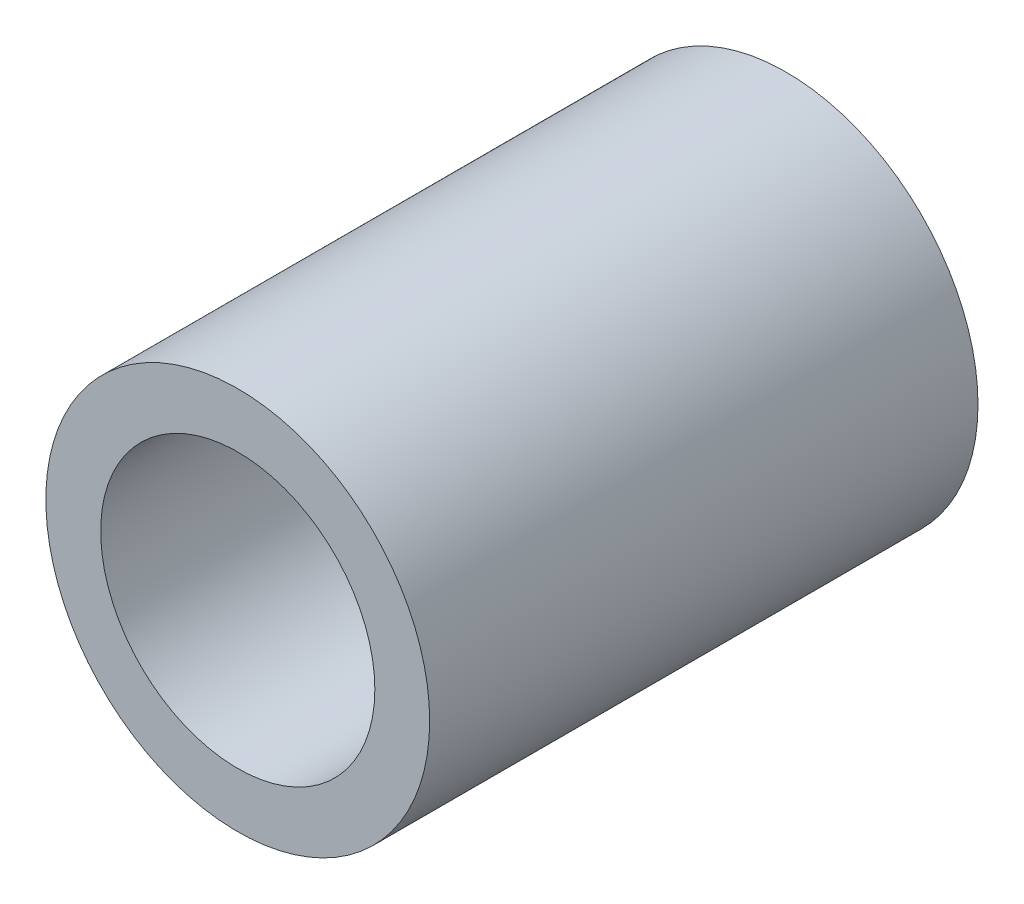
ISO-10303-21;
HEADER;
FILE_DESCRIPTION(('STEP AP214'),'2;1');
FILE_NAME('part.step','',(''),(''),'','','');
FILE_SCHEMA(('AUTOMOTIVE_DESIGN { 1 0 10303 214 1 1 1 1 }'));
ENDSEC;
DATA;
#1=APPLICATION_CONTEXT('core data for automotive mechanical design processes');
#2=APPLICATION_PROTOCOL_DEFINITION('international standard','automotive_design',2000,#1);
#3=PRODUCT_CONTEXT('',#1,'mechanical');
#4=PRODUCT('Part','Part','',(#3));
#5=PRODUCT_RELATED_PRODUCT_CATEGORY('part','',(#4));
#6=PRODUCT_DEFINITION_FORMATION('','',#4);
#7=PRODUCT_DEFINITION_CONTEXT('part definition',#1,'design');
#8=PRODUCT_DEFINITION('design','',#6,#7);
#9=PRODUCT_DEFINITION_SHAPE('','',#8);
#10=(LENGTH_UNIT() NAMED_UNIT(*) SI_UNIT(.MILLI.,.METRE.));
#11=(NAMED_UNIT(*) PLANE_ANGLE_UNIT() SI_UNIT($,.RADIAN.));
#12=(NAMED_UNIT(*) SI_UNIT($,.STERADIAN.) SOLID_ANGLE_UNIT());
#13=UNCERTAINTY_MEASURE_WITH_UNIT(LENGTH_MEASURE(1.E-05),#10,'distance_accuracy_value','');
#14=(GEOMETRIC_REPRESENTATION_CONTEXT(3) GLOBAL_UNCERTAINTY_ASSIGNED_CONTEXT((#13)) GLOBAL_UNIT_ASSIGNED_CONTEXT((#10,
#11,#12)) REPRESENTATION_CONTEXT('',''));
#15=CARTESIAN_POINT('',(0.,0.,0.));
#16=DIRECTION('',(0.,0.,1.));
#17=DIRECTION('',(1.,0.,0.));
#18=AXIS2_PLACEMENT_3D('',#15,#16,#17);
#19=CARTESIAN_POINT('',(0.,0.,40.));
#20=DIRECTION('',(0.,0.,1.));
#21=DIRECTION('',(1.,0.,0.));
#22=AXIS2_PLACEMENT_3D('',#19,#20,#21);
#23=PLANE('',#22);
#24=CARTESIAN_POINT('',(0.,0.,40.));
#25=DIRECTION('',(0.,0.,1.));
#26=DIRECTION('',(1.,0.,0.));
#27=AXIS2_PLACEMENT_3D('',#24,#25,#26);
#28=CIRCLE('',#27,14.);
#29=CARTESIAN_POINT('',(14.,0.,40.));
#30=VERTEX_POINT('',#29);
#31=EDGE_CURVE('E10',#30,#30,#28,.T.);
#32=ORIENTED_EDGE('',*,*,#31,.T.);
#33=EDGE_LOOP('',(#32));
#34=FACE_BOUND('',#33,.T.);
#35=CARTESIAN_POINT('',(0.,0.,40.));
#36=DIRECTION('',(0.,0.,1.));
#37=DIRECTION('',(1.,0.,0.));
#38=AXIS2_PLACEMENT_3D('',#35,#36,#37);
#39=CIRCLE('',#38,10.);
#40=CARTESIAN_POINT('',(10.,0.,40.));
#41=VERTEX_POINT('',#40);
#42=EDGE_CURVE('E43',#41,#41,#39,.T.);
#43=ORIENTED_EDGE('',*,*,#42,.F.);
#44=EDGE_LOOP('',(#43));
#45=FACE_BOUND('',#44,.T.);
#46=ADVANCED_FACE('F32',(#34,#45),#23,.T.);
#47=CARTESIAN_POINT('',(0.,0.,0.));
#48=DIRECTION('',(0.,0.,1.));
#49=DIRECTION('',(1.,0.,0.));
#50=AXIS2_PLACEMENT_3D('',#47,#48,#49);
#51=PLANE('',#50);
#52=CARTESIAN_POINT('',(0.,0.,0.));
#53=DIRECTION('',(0.,0.,1.));
#54=DIRECTION('',(1.,0.,0.));
#55=AXIS2_PLACEMENT_3D('',#52,#53,#54);
#56=CIRCLE('',#55,14.);
#57=CARTESIAN_POINT('',(14.,0.,0.));
#58=VERTEX_POINT('',#57);
#59=EDGE_CURVE('E39',#58,#58,#56,.T.);
#60=ORIENTED_EDGE('',*,*,#59,.F.);
#61=EDGE_LOOP('',(#60));
#62=FACE_BOUND('',#61,.T.);
#63=CARTESIAN_POINT('',(0.,0.,0.));
#64=DIRECTION('',(0.,0.,1.));
#65=DIRECTION('',(1.,0.,0.));
#66=AXIS2_PLACEMENT_3D('',#63,#64,#65);
#67=CIRCLE('',#66,10.);
#68=CARTESIAN_POINT('',(10.,0.,0.));
#69=VERTEX_POINT('',#68);
#70=EDGE_CURVE('E47',#69,#69,#67,.T.);
#71=ORIENTED_EDGE('',*,*,#70,.T.);
#72=EDGE_LOOP('',(#71));
#73=FACE_BOUND('',#72,.T.);
#74=ADVANCED_FACE('F53',(#62,#73),#51,.F.);
#75=CARTESIAN_POINT('',(0.,0.,40.));
#76=DIRECTION('',(0.,0.,-1.));
#77=DIRECTION('',(-1.,0.,0.));
#78=AXIS2_PLACEMENT_3D('',#75,#76,#77);
#79=CYLINDRICAL_SURFACE('',#78,14.);
#80=ORIENTED_EDGE('',*,*,#31,.F.);
#81=EDGE_LOOP('',(#80));
#82=FACE_BOUND('',#81,.T.);
#83=ORIENTED_EDGE('',*,*,#59,.T.);
#84=EDGE_LOOP('',(#83));
#85=FACE_BOUND('',#84,.T.);
#86=ADVANCED_FACE('F34',(#82,#85),#79,.T.);
#87=CARTESIAN_POINT('',(0.,0.,40.));
#88=DIRECTION('',(0.,0.,-1.));
#89=DIRECTION('',(-1.,0.,0.));
#90=AXIS2_PLACEMENT_3D('',#87,#88,#89);
#91=CYLINDRICAL_SURFACE('',#90,10.);
#92=ORIENTED_EDGE('',*,*,#42,.T.);
#93=EDGE_LOOP('',(#92));
#94=FACE_BOUND('',#93,.T.);
#95=ORIENTED_EDGE('',*,*,#70,.F.);
#96=EDGE_LOOP('',(#95));
#97=FACE_BOUND('',#96,.T.);
#98=ADVANCED_FACE('F55',(#94,#97),#91,.F.);
#99=CLOSED_SHELL('',(#46,#74,#86,#98));
#100=MANIFOLD_SOLID_BREP('B2',#99);
#101=ADVANCED_BREP_SHAPE_REPRESENTATION('',(#18,#100),#14);
#102=SHAPE_DEFINITION_REPRESENTATION(#9,#101);
ENDSEC;
END-ISO-10303-21;
